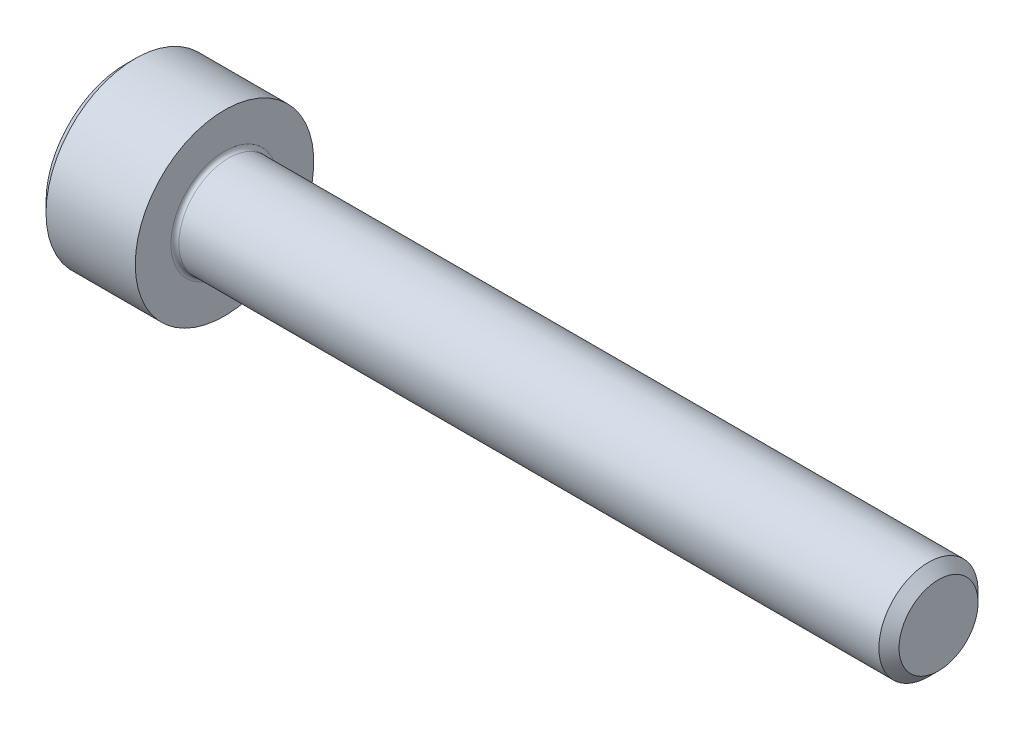
ISO-10303-21;
HEADER;
FILE_DESCRIPTION(('STEP AP214'),'2;1');
FILE_NAME('part.step','',(''),(''),'','','');
FILE_SCHEMA(('AUTOMOTIVE_DESIGN { 1 0 10303 214 1 1 1 1 }'));
ENDSEC;
DATA;
#1=APPLICATION_CONTEXT('core data for automotive mechanical design processes');
#2=APPLICATION_PROTOCOL_DEFINITION('international standard','automotive_design',2000,#1);
#3=PRODUCT_CONTEXT('',#1,'mechanical');
#4=PRODUCT('Part','Part','',(#3));
#5=PRODUCT_RELATED_PRODUCT_CATEGORY('part','',(#4));
#6=PRODUCT_DEFINITION_FORMATION('','',#4);
#7=PRODUCT_DEFINITION_CONTEXT('part definition',#1,'design');
#8=PRODUCT_DEFINITION('design','',#6,#7);
#9=PRODUCT_DEFINITION_SHAPE('','',#8);
#10=(LENGTH_UNIT() NAMED_UNIT(*) SI_UNIT(.MILLI.,.METRE.));
#11=(NAMED_UNIT(*) PLANE_ANGLE_UNIT() SI_UNIT($,.RADIAN.));
#12=(NAMED_UNIT(*) SI_UNIT($,.STERADIAN.) SOLID_ANGLE_UNIT());
#13=UNCERTAINTY_MEASURE_WITH_UNIT(LENGTH_MEASURE(1.E-05),#10,'distance_accuracy_value','');
#14=(GEOMETRIC_REPRESENTATION_CONTEXT(3) GLOBAL_UNCERTAINTY_ASSIGNED_CONTEXT((#13)) GLOBAL_UNIT_ASSIGNED_CONTEXT((#10,
#11,#12)) REPRESENTATION_CONTEXT('',''));
#15=CARTESIAN_POINT('',(0.,0.,0.));
#16=DIRECTION('',(0.,0.,1.));
#17=DIRECTION('',(1.,0.,0.));
#18=AXIS2_PLACEMENT_3D('',#15,#16,#17);
#19=CARTESIAN_POINT('',(0.,0.,0.));
#20=DIRECTION('',(-1.,0.,0.));
#21=DIRECTION('',(0.,0.,1.));
#22=AXIS2_PLACEMENT_3D('',#19,#20,#21);
#23=PLANE('',#22);
#24=DIRECTION('',(0.,-0.5,0.866025403784438));
#25=VECTOR('',#24,1.);
#26=CARTESIAN_POINT('',(0.,1.18068130049278,0.));
#27=LINE('',#26,#25);
#28=CARTESIAN_POINT('',(0.,1.18068130049278,0.));
#29=VERTEX_POINT('',#28);
#30=CARTESIAN_POINT('',(0.,0.59034065024639,1.0225));
#31=VERTEX_POINT('',#30);
#32=EDGE_CURVE('E272',#29,#31,#27,.T.);
#33=ORIENTED_EDGE('',*,*,#32,.T.);
#34=DIRECTION('',(0.,1.,0.));
#35=VECTOR('',#34,1.);
#36=CARTESIAN_POINT('',(0.,-0.590340650246395,1.0225));
#37=LINE('',#36,#35);
#38=CARTESIAN_POINT('',(0.,-0.590340650246395,1.0225));
#39=VERTEX_POINT('',#38);
#40=EDGE_CURVE('E143',#39,#31,#37,.T.);
#41=ORIENTED_EDGE('',*,*,#40,.F.);
#42=DIRECTION('',(0.,-0.500000000000001,-0.866025403784438));
#43=VECTOR('',#42,1.);
#44=CARTESIAN_POINT('',(0.,-0.590340650246395,1.0225));
#45=LINE('',#44,#43);
#46=CARTESIAN_POINT('',(0.,-1.18068130049279,0.));
#47=VERTEX_POINT('',#46);
#48=EDGE_CURVE('E275',#39,#47,#45,.T.);
#49=ORIENTED_EDGE('',*,*,#48,.T.);
#50=DIRECTION('',(0.,0.5,-0.866025403784439));
#51=VECTOR('',#50,1.);
#52=CARTESIAN_POINT('',(0.,-1.18068130049279,0.));
#53=LINE('',#52,#51);
#54=CARTESIAN_POINT('',(0.,-0.590340650246397,-1.0225));
#55=VERTEX_POINT('',#54);
#56=EDGE_CURVE('E278',#47,#55,#53,.T.);
#57=ORIENTED_EDGE('',*,*,#56,.T.);
#58=DIRECTION('',(0.,-1.,0.));
#59=VECTOR('',#58,1.);
#60=CARTESIAN_POINT('',(0.,0.590340650246389,-1.0225));
#61=LINE('',#60,#59);
#62=CARTESIAN_POINT('',(0.,0.590340650246389,-1.0225));
#63=VERTEX_POINT('',#62);
#64=EDGE_CURVE('E281',#63,#55,#61,.T.);
#65=ORIENTED_EDGE('',*,*,#64,.F.);
#66=DIRECTION('',(0.,-0.500000000000001,-0.866025403784438));
#67=VECTOR('',#66,1.);
#68=CARTESIAN_POINT('',(0.,1.18068130049278,0.));
#69=LINE('',#68,#67);
#70=EDGE_CURVE('E138',#29,#63,#69,.T.);
#71=ORIENTED_EDGE('',*,*,#70,.F.);
#72=EDGE_LOOP('',(#33,#41,#49,#57,#65,#71));
#73=FACE_BOUND('',#72,.T.);
#74=CARTESIAN_POINT('',(0.,0.,0.));
#75=DIRECTION('',(-1.,0.,0.));
#76=DIRECTION('',(0.,0.,1.));
#77=AXIS2_PLACEMENT_3D('',#74,#75,#76);
#78=CIRCLE('',#77,2.);
#79=CARTESIAN_POINT('',(0.,0.,2.));
#80=VERTEX_POINT('',#79);
#81=EDGE_CURVE('E167',#80,#80,#78,.T.);
#82=ORIENTED_EDGE('',*,*,#81,.T.);
#83=EDGE_LOOP('',(#82));
#84=FACE_BOUND('',#83,.T.);
#85=ADVANCED_FACE('F47',(#73,#84),#23,.T.);
#86=CARTESIAN_POINT('',(0.,0.,0.));
#87=DIRECTION('',(1.,0.,0.));
#88=DIRECTION('',(0.,0.,-1.));
#89=AXIS2_PLACEMENT_3D('',#86,#87,#88);
#90=CONICAL_SURFACE('',#89,2.,0.785398163397448);
#91=CARTESIAN_POINT('',(0.25,0.,0.));
#92=DIRECTION('',(-1.,0.,0.));
#93=DIRECTION('',(0.,0.,1.));
#94=AXIS2_PLACEMENT_3D('',#91,#92,#93);
#95=CIRCLE('',#94,2.25);
#96=CARTESIAN_POINT('',(0.25,0.,2.25));
#97=VERTEX_POINT('',#96);
#98=EDGE_CURVE('E164',#97,#97,#95,.T.);
#99=ORIENTED_EDGE('',*,*,#98,.T.);
#100=EDGE_LOOP('',(#99));
#101=FACE_BOUND('',#100,.T.);
#102=ORIENTED_EDGE('',*,*,#81,.F.);
#103=EDGE_LOOP('',(#102));
#104=FACE_BOUND('',#103,.T.);
#105=ADVANCED_FACE('F188',(#101,#104),#90,.T.);
#106=CARTESIAN_POINT('',(-31.75,0.,0.));
#107=DIRECTION('',(-1.,0.,0.));
#108=DIRECTION('',(0.,0.,1.));
#109=AXIS2_PLACEMENT_3D('',#106,#107,#108);
#110=CYLINDRICAL_SURFACE('',#109,2.25);
#111=CARTESIAN_POINT('',(2.5,0.,0.));
#112=DIRECTION('',(-1.,0.,0.));
#113=DIRECTION('',(0.,0.,1.));
#114=AXIS2_PLACEMENT_3D('',#111,#112,#113);
#115=CIRCLE('',#114,2.25);
#116=CARTESIAN_POINT('',(2.5,0.,2.25));
#117=VERTEX_POINT('',#116);
#118=EDGE_CURVE('E161',#117,#117,#115,.T.);
#119=ORIENTED_EDGE('',*,*,#118,.T.);
#120=EDGE_LOOP('',(#119));
#121=FACE_BOUND('',#120,.T.);
#122=ORIENTED_EDGE('',*,*,#98,.F.);
#123=EDGE_LOOP('',(#122));
#124=FACE_BOUND('',#123,.T.);
#125=ADVANCED_FACE('F193',(#121,#124),#110,.T.);
#126=CARTESIAN_POINT('',(2.5,2.25,0.));
#127=DIRECTION('',(1.,0.,0.));
#128=DIRECTION('',(0.,0.,-1.));
#129=AXIS2_PLACEMENT_3D('',#126,#127,#128);
#130=PLANE('',#129);
#131=CARTESIAN_POINT('',(2.5,0.,0.));
#132=DIRECTION('',(1.,0.,0.));
#133=DIRECTION('',(0.,0.,-1.));
#134=AXIS2_PLACEMENT_3D('',#131,#132,#133);
#135=CIRCLE('',#134,1.34999999999999);
#136=CARTESIAN_POINT('',(2.5,0.,-1.34999999999999));
#137=VERTEX_POINT('',#136);
#138=EDGE_CURVE('E55',#137,#137,#135,.F.);
#139=ORIENTED_EDGE('',*,*,#138,.T.);
#140=EDGE_LOOP('',(#139));
#141=FACE_BOUND('',#140,.T.);
#142=ORIENTED_EDGE('',*,*,#118,.F.);
#143=EDGE_LOOP('',(#142));
#144=FACE_BOUND('',#143,.T.);
#145=ADVANCED_FACE('F172',(#141,#144),#130,.T.);
#146=CARTESIAN_POINT('',(-31.75,0.,0.));
#147=DIRECTION('',(-1.,0.,0.));
#148=DIRECTION('',(0.,0.,1.));
#149=AXIS2_PLACEMENT_3D('',#146,#147,#148);
#150=CYLINDRICAL_SURFACE('',#149,1.24999999999999);
#151=CARTESIAN_POINT('',(2.6,0.,0.));
#152=DIRECTION('',(1.,0.,0.));
#153=DIRECTION('',(0.,0.,-1.));
#154=AXIS2_PLACEMENT_3D('',#151,#152,#153);
#155=CIRCLE('',#154,1.24999999999999);
#156=CARTESIAN_POINT('',(2.6,0.,-1.24999999999999));
#157=VERTEX_POINT('',#156);
#158=EDGE_CURVE('E13',#157,#157,#155,.T.);
#159=ORIENTED_EDGE('',*,*,#158,.T.);
#160=EDGE_LOOP('',(#159));
#161=FACE_BOUND('',#160,.T.);
#162=CARTESIAN_POINT('',(20.2465,0.,0.));
#163=DIRECTION('',(-1.,0.,0.));
#164=DIRECTION('',(0.,0.,1.));
#165=AXIS2_PLACEMENT_3D('',#162,#163,#164);
#166=CIRCLE('',#165,1.24999999999998);
#167=CARTESIAN_POINT('',(20.2465,0.,1.24999999999998));
#168=VERTEX_POINT('',#167);
#169=EDGE_CURVE('E158',#168,#168,#166,.T.);
#170=ORIENTED_EDGE('',*,*,#169,.T.);
#171=EDGE_LOOP('',(#170));
#172=FACE_BOUND('',#171,.T.);
#173=ADVANCED_FACE('F203',(#161,#172),#150,.T.);
#174=CARTESIAN_POINT('',(20.5,0.,0.));
#175=DIRECTION('',(-1.,0.,0.));
#176=DIRECTION('',(0.,0.,1.));
#177=AXIS2_PLACEMENT_3D('',#174,#175,#176);
#178=CONICAL_SURFACE('',#177,0.996499999999964,0.785398163397469);
#179=ORIENTED_EDGE('',*,*,#169,.F.);
#180=EDGE_LOOP('',(#179));
#181=FACE_BOUND('',#180,.T.);
#182=CARTESIAN_POINT('',(20.5,0.,0.));
#183=DIRECTION('',(-1.,0.,0.));
#184=DIRECTION('',(0.,0.,1.));
#185=AXIS2_PLACEMENT_3D('',#182,#183,#184);
#186=CIRCLE('',#185,0.996499999999964);
#187=CARTESIAN_POINT('',(20.5,0.,0.996499999999964));
#188=VERTEX_POINT('',#187);
#189=EDGE_CURVE('E154',#188,#188,#186,.T.);
#190=ORIENTED_EDGE('',*,*,#189,.T.);
#191=EDGE_LOOP('',(#190));
#192=FACE_BOUND('',#191,.T.);
#193=ADVANCED_FACE('F183',(#181,#192),#178,.T.);
#194=CARTESIAN_POINT('',(20.5,0.996499999999964,0.));
#195=DIRECTION('',(1.,0.,0.));
#196=DIRECTION('',(0.,0.,-1.));
#197=AXIS2_PLACEMENT_3D('',#194,#195,#196);
#198=PLANE('',#197);
#199=ORIENTED_EDGE('',*,*,#189,.F.);
#200=EDGE_LOOP('',(#199));
#201=FACE_BOUND('',#200,.T.);
#202=ADVANCED_FACE('F176',(#201),#198,.T.);
#203=CARTESIAN_POINT('',(2.6,0.,0.));
#204=DIRECTION('',(1.,0.,0.));
#205=DIRECTION('',(0.,0.,-1.));
#206=AXIS2_PLACEMENT_3D('',#203,#204,#205);
#207=TOROIDAL_SURFACE('',#206,1.34999999999999,0.1);
#208=ORIENTED_EDGE('',*,*,#158,.F.);
#209=EDGE_LOOP('',(#208));
#210=FACE_BOUND('',#209,.T.);
#211=ORIENTED_EDGE('',*,*,#138,.F.);
#212=EDGE_LOOP('',(#211));
#213=FACE_BOUND('',#212,.T.);
#214=ADVANCED_FACE('F49',(#210,#213),#207,.F.);
#215=CARTESIAN_POINT('',(1.1,1.18068130049278,0.));
#216=DIRECTION('',(0.,-0.866025403784439,-0.5));
#217=DIRECTION('',(0.,0.5,-0.866025403784438));
#218=AXIS2_PLACEMENT_3D('',#215,#216,#217);
#219=PLANE('',#218);
#220=ORIENTED_EDGE('',*,*,#32,.F.);
#221=DIRECTION('',(-1.,0.,0.));
#222=VECTOR('',#221,1.);
#223=CARTESIAN_POINT('',(1.1,1.18068130049278,0.));
#224=LINE('',#223,#222);
#225=CARTESIAN_POINT('',(1.1,1.18068130049278,0.));
#226=VERTEX_POINT('',#225);
#227=EDGE_CURVE('E262',#226,#29,#224,.T.);
#228=ORIENTED_EDGE('',*,*,#227,.F.);
#229=DIRECTION('',(0.,-0.5,0.866025403784438));
#230=VECTOR('',#229,1.);
#231=CARTESIAN_POINT('',(1.1,1.18068130049278,0.));
#232=LINE('',#231,#230);
#233=CARTESIAN_POINT('',(1.1,0.885510975369585,0.511249999999998));
#234=VERTEX_POINT('',#233);
#235=EDGE_CURVE('E130',#226,#234,#232,.T.);
#236=ORIENTED_EDGE('',*,*,#235,.T.);
#237=CARTESIAN_POINT('',(1.1,0.59034065024639,1.0225));
#238=VERTEX_POINT('',#237);
#239=EDGE_CURVE('E121',#234,#238,#232,.T.);
#240=ORIENTED_EDGE('',*,*,#239,.T.);
#241=DIRECTION('',(-1.,0.,0.));
#242=VECTOR('',#241,1.);
#243=CARTESIAN_POINT('',(1.1,0.59034065024639,1.0225));
#244=LINE('',#243,#242);
#245=EDGE_CURVE('E135',#238,#31,#244,.T.);
#246=ORIENTED_EDGE('',*,*,#245,.T.);
#247=EDGE_LOOP('',(#220,#228,#236,#240,#246));
#248=FACE_BOUND('',#247,.T.);
#249=ADVANCED_FACE('F134',(#248),#219,.T.);
#250=CARTESIAN_POINT('',(1.1,-0.590340650246395,1.0225));
#251=DIRECTION('',(0.,0.,1.));
#252=DIRECTION('',(0.,-1.,0.));
#253=AXIS2_PLACEMENT_3D('',#250,#251,#252);
#254=PLANE('',#253);
#255=ORIENTED_EDGE('',*,*,#40,.T.);
#256=ORIENTED_EDGE('',*,*,#245,.F.);
#257=DIRECTION('',(0.,1.,0.));
#258=VECTOR('',#257,1.);
#259=CARTESIAN_POINT('',(1.1,-0.590340650246395,1.0225));
#260=LINE('',#259,#258);
#261=CARTESIAN_POINT('',(1.1,0.,1.0225));
#262=VERTEX_POINT('',#261);
#263=EDGE_CURVE('E118',#262,#238,#260,.T.);
#264=ORIENTED_EDGE('',*,*,#263,.F.);
#265=CARTESIAN_POINT('',(1.1,-0.590340650246395,1.0225));
#266=VERTEX_POINT('',#265);
#267=EDGE_CURVE('E129',#266,#262,#260,.T.);
#268=ORIENTED_EDGE('',*,*,#267,.F.);
#269=DIRECTION('',(-1.,0.,0.));
#270=VECTOR('',#269,1.);
#271=CARTESIAN_POINT('',(1.1,-0.590340650246395,1.0225));
#272=LINE('',#271,#270);
#273=EDGE_CURVE('E145',#266,#39,#272,.T.);
#274=ORIENTED_EDGE('',*,*,#273,.T.);
#275=EDGE_LOOP('',(#255,#256,#264,#268,#274));
#276=FACE_BOUND('',#275,.T.);
#277=ADVANCED_FACE('F140',(#276),#254,.F.);
#278=CARTESIAN_POINT('',(1.1,-0.590340650246395,1.0225));
#279=DIRECTION('',(0.,0.866025403784438,-0.500000000000001));
#280=DIRECTION('',(0.,0.500000000000001,0.866025403784438));
#281=AXIS2_PLACEMENT_3D('',#278,#279,#280);
#282=PLANE('',#281);
#283=ORIENTED_EDGE('',*,*,#48,.F.);
#284=ORIENTED_EDGE('',*,*,#273,.F.);
#285=DIRECTION('',(0.,-0.500000000000001,-0.866025403784438));
#286=VECTOR('',#285,1.);
#287=CARTESIAN_POINT('',(1.1,-0.590340650246395,1.0225));
#288=LINE('',#287,#286);
#289=CARTESIAN_POINT('',(1.1,-0.88551097536959,0.511250000000002));
#290=VERTEX_POINT('',#289);
#291=EDGE_CURVE('E301',#266,#290,#288,.T.);
#292=ORIENTED_EDGE('',*,*,#291,.T.);
#293=CARTESIAN_POINT('',(1.1,-1.18068130049279,0.));
#294=VERTEX_POINT('',#293);
#295=EDGE_CURVE('E290',#290,#294,#288,.T.);
#296=ORIENTED_EDGE('',*,*,#295,.T.);
#297=DIRECTION('',(-1.,0.,0.));
#298=VECTOR('',#297,1.);
#299=CARTESIAN_POINT('',(1.1,-1.18068130049279,0.));
#300=LINE('',#299,#298);
#301=EDGE_CURVE('E150',#294,#47,#300,.T.);
#302=ORIENTED_EDGE('',*,*,#301,.T.);
#303=EDGE_LOOP('',(#283,#284,#292,#296,#302));
#304=FACE_BOUND('',#303,.T.);
#305=ADVANCED_FACE('F216',(#304),#282,.T.);
#306=CARTESIAN_POINT('',(1.1,-1.18068130049279,0.));
#307=DIRECTION('',(0.,0.866025403784439,0.5));
#308=DIRECTION('',(0.,-0.5,0.866025403784439));
#309=AXIS2_PLACEMENT_3D('',#306,#307,#308);
#310=PLANE('',#309);
#311=ORIENTED_EDGE('',*,*,#56,.F.);
#312=ORIENTED_EDGE('',*,*,#301,.F.);
#313=DIRECTION('',(0.,0.5,-0.866025403784439));
#314=VECTOR('',#313,1.);
#315=CARTESIAN_POINT('',(1.1,-1.18068130049279,0.));
#316=LINE('',#315,#314);
#317=CARTESIAN_POINT('',(1.1,-0.885510975369592,-0.511250000000002));
#318=VERTEX_POINT('',#317);
#319=EDGE_CURVE('E268',#294,#318,#316,.T.);
#320=ORIENTED_EDGE('',*,*,#319,.T.);
#321=CARTESIAN_POINT('',(1.1,-0.590340650246397,-1.0225));
#322=VERTEX_POINT('',#321);
#323=EDGE_CURVE('E300',#318,#322,#316,.T.);
#324=ORIENTED_EDGE('',*,*,#323,.T.);
#325=DIRECTION('',(-1.,0.,0.));
#326=VECTOR('',#325,1.);
#327=CARTESIAN_POINT('',(1.1,-0.590340650246397,-1.0225));
#328=LINE('',#327,#326);
#329=EDGE_CURVE('E261',#322,#55,#328,.T.);
#330=ORIENTED_EDGE('',*,*,#329,.T.);
#331=EDGE_LOOP('',(#311,#312,#320,#324,#330));
#332=FACE_BOUND('',#331,.T.);
#333=ADVANCED_FACE('F219',(#332),#310,.T.);
#334=CARTESIAN_POINT('',(1.1,0.590340650246389,-1.0225));
#335=DIRECTION('',(0.,0.,-1.));
#336=DIRECTION('',(0.,1.,0.));
#337=AXIS2_PLACEMENT_3D('',#334,#335,#336);
#338=PLANE('',#337);
#339=ORIENTED_EDGE('',*,*,#64,.T.);
#340=ORIENTED_EDGE('',*,*,#329,.F.);
#341=DIRECTION('',(0.,-1.,0.));
#342=VECTOR('',#341,1.);
#343=CARTESIAN_POINT('',(1.1,0.590340650246389,-1.0225));
#344=LINE('',#343,#342);
#345=CARTESIAN_POINT('',(1.1,0.,-1.0225));
#346=VERTEX_POINT('',#345);
#347=EDGE_CURVE('E265',#346,#322,#344,.T.);
#348=ORIENTED_EDGE('',*,*,#347,.F.);
#349=CARTESIAN_POINT('',(1.1,0.590340650246389,-1.0225));
#350=VERTEX_POINT('',#349);
#351=EDGE_CURVE('E62',#350,#346,#344,.T.);
#352=ORIENTED_EDGE('',*,*,#351,.F.);
#353=DIRECTION('',(-1.,0.,0.));
#354=VECTOR('',#353,1.);
#355=CARTESIAN_POINT('',(1.1,0.590340650246389,-1.0225));
#356=LINE('',#355,#354);
#357=EDGE_CURVE('E258',#350,#63,#356,.T.);
#358=ORIENTED_EDGE('',*,*,#357,.T.);
#359=EDGE_LOOP('',(#339,#340,#348,#352,#358));
#360=FACE_BOUND('',#359,.T.);
#361=ADVANCED_FACE('F223',(#360),#338,.F.);
#362=CARTESIAN_POINT('',(1.1,1.18068130049278,0.));
#363=DIRECTION('',(0.,0.866025403784438,-0.500000000000001));
#364=DIRECTION('',(0.,0.500000000000001,0.866025403784438));
#365=AXIS2_PLACEMENT_3D('',#362,#363,#364);
#366=PLANE('',#365);
#367=ORIENTED_EDGE('',*,*,#70,.T.);
#368=ORIENTED_EDGE('',*,*,#357,.F.);
#369=DIRECTION('',(0.,-0.500000000000001,-0.866025403784438));
#370=VECTOR('',#369,1.);
#371=CARTESIAN_POINT('',(1.1,1.18068130049278,0.));
#372=LINE('',#371,#370);
#373=CARTESIAN_POINT('',(1.1,0.885510975369587,-0.511250000000001));
#374=VERTEX_POINT('',#373);
#375=EDGE_CURVE('E248',#374,#350,#372,.T.);
#376=ORIENTED_EDGE('',*,*,#375,.F.);
#377=EDGE_CURVE('E254',#226,#374,#372,.T.);
#378=ORIENTED_EDGE('',*,*,#377,.F.);
#379=ORIENTED_EDGE('',*,*,#227,.T.);
#380=EDGE_LOOP('',(#367,#368,#376,#378,#379));
#381=FACE_BOUND('',#380,.T.);
#382=ADVANCED_FACE('F227',(#381),#366,.F.);
#383=CARTESIAN_POINT('',(1.1,1.18068130049278,0.));
#384=DIRECTION('',(1.,0.,0.));
#385=DIRECTION('',(0.,0.,-1.));
#386=AXIS2_PLACEMENT_3D('',#383,#384,#385);
#387=PLANE('',#386);
#388=ORIENTED_EDGE('',*,*,#347,.T.);
#389=ORIENTED_EDGE('',*,*,#323,.F.);
#390=CARTESIAN_POINT('',(1.1,0.,0.));
#391=DIRECTION('',(-1.,0.,0.));
#392=DIRECTION('',(0.,0.,1.));
#393=AXIS2_PLACEMENT_3D('',#390,#391,#392);
#394=CIRCLE('',#393,1.0225);
#395=EDGE_CURVE('E296',#346,#318,#394,.T.);
#396=ORIENTED_EDGE('',*,*,#395,.F.);
#397=EDGE_LOOP('',(#388,#389,#396));
#398=FACE_BOUND('',#397,.T.);
#399=ADVANCED_FACE('F231',(#398),#387,.F.);
#400=ORIENTED_EDGE('',*,*,#319,.F.);
#401=ORIENTED_EDGE('',*,*,#295,.F.);
#402=EDGE_CURVE('E148',#318,#290,#394,.T.);
#403=ORIENTED_EDGE('',*,*,#402,.F.);
#404=EDGE_LOOP('',(#400,#401,#403));
#405=FACE_BOUND('',#404,.T.);
#406=ADVANCED_FACE('F234',(#405),#387,.F.);
#407=ORIENTED_EDGE('',*,*,#291,.F.);
#408=ORIENTED_EDGE('',*,*,#267,.T.);
#409=EDGE_CURVE('E144',#290,#262,#394,.T.);
#410=ORIENTED_EDGE('',*,*,#409,.F.);
#411=EDGE_LOOP('',(#407,#408,#410));
#412=FACE_BOUND('',#411,.T.);
#413=ADVANCED_FACE('F239',(#412),#387,.F.);
#414=ORIENTED_EDGE('',*,*,#263,.T.);
#415=ORIENTED_EDGE('',*,*,#239,.F.);
#416=EDGE_CURVE('E124',#262,#234,#394,.T.);
#417=ORIENTED_EDGE('',*,*,#416,.F.);
#418=EDGE_LOOP('',(#414,#415,#417));
#419=FACE_BOUND('',#418,.T.);
#420=ADVANCED_FACE('F120',(#419),#387,.F.);
#421=ORIENTED_EDGE('',*,*,#235,.F.);
#422=ORIENTED_EDGE('',*,*,#377,.T.);
#423=EDGE_CURVE('E155',#234,#374,#394,.T.);
#424=ORIENTED_EDGE('',*,*,#423,.F.);
#425=EDGE_LOOP('',(#421,#422,#424));
#426=FACE_BOUND('',#425,.T.);
#427=ADVANCED_FACE('F242',(#426),#387,.F.);
#428=ORIENTED_EDGE('',*,*,#375,.T.);
#429=ORIENTED_EDGE('',*,*,#351,.T.);
#430=EDGE_CURVE('E251',#374,#346,#394,.T.);
#431=ORIENTED_EDGE('',*,*,#430,.F.);
#432=EDGE_LOOP('',(#428,#429,#431));
#433=FACE_BOUND('',#432,.T.);
#434=ADVANCED_FACE('F212',(#433),#387,.F.);
#435=CARTESIAN_POINT('',(1.1,0.,0.));
#436=DIRECTION('',(-1.,0.,0.));
#437=DIRECTION('',(0.,0.,1.));
#438=AXIS2_PLACEMENT_3D('',#435,#436,#437);
#439=CONICAL_SURFACE('',#438,1.0225,1.04719755119659);
#440=CARTESIAN_POINT('',(1.6903406502464,0.,0.));
#441=VERTEX_POINT('',#440);
#442=VERTEX_LOOP('',#441);
#443=FACE_BOUND('',#442,.T.);
#444=ORIENTED_EDGE('',*,*,#416,.T.);
#445=ORIENTED_EDGE('',*,*,#423,.T.);
#446=ORIENTED_EDGE('',*,*,#430,.T.);
#447=ORIENTED_EDGE('',*,*,#395,.T.);
#448=ORIENTED_EDGE('',*,*,#402,.T.);
#449=ORIENTED_EDGE('',*,*,#409,.T.);
#450=EDGE_LOOP('',(#444,#445,#446,#447,#448,#449));
#451=FACE_BOUND('',#450,.T.);
#452=ADVANCED_FACE('F210',(#443,#451),#439,.F.);
#453=CLOSED_SHELL('',(#85,#105,#125,#145,#173,#193,#202,#214,#249,#277,#305,#333,#361,#382,#399,
#406,#413,#420,#427,#434,#452));
#454=MANIFOLD_SOLID_BREP('B2',#453);
#455=ADVANCED_BREP_SHAPE_REPRESENTATION('',(#18,#454),#14);
#456=SHAPE_DEFINITION_REPRESENTATION(#9,#455);
ENDSEC;
END-ISO-10303-21;
